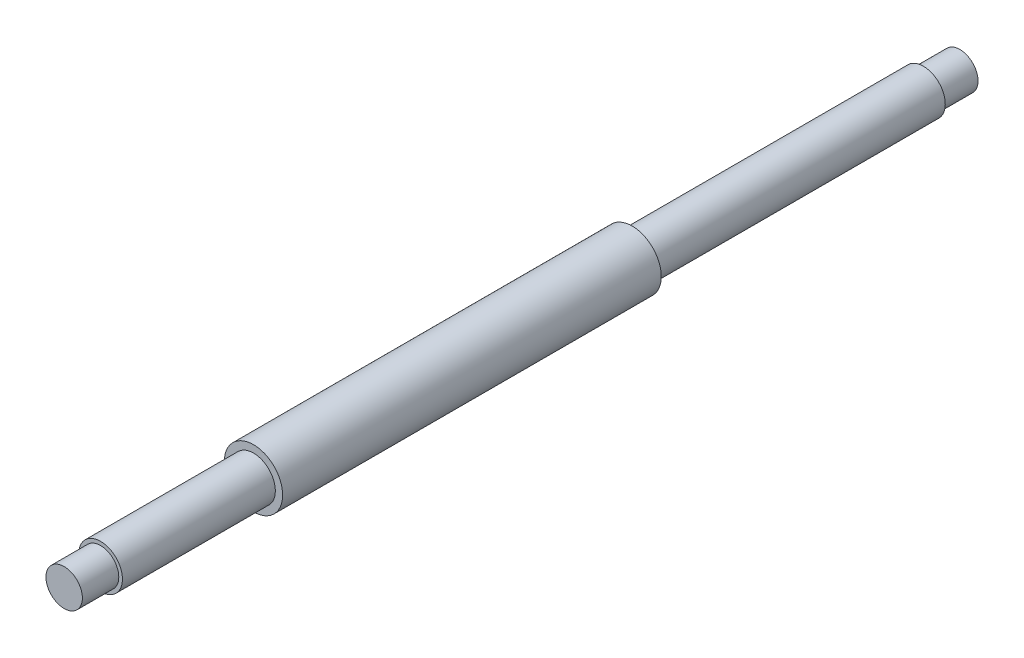
ISO-10303-21;
HEADER;
FILE_DESCRIPTION(('STEP AP214'),'2;1');
FILE_NAME('part.step','',(''),(''),'','','');
FILE_SCHEMA(('AUTOMOTIVE_DESIGN { 1 0 10303 214 1 1 1 1 }'));
ENDSEC;
DATA;
#1=APPLICATION_CONTEXT('core data for automotive mechanical design processes');
#2=APPLICATION_PROTOCOL_DEFINITION('international standard','automotive_design',2000,#1);
#3=PRODUCT_CONTEXT('',#1,'mechanical');
#4=PRODUCT('Part','Part','',(#3));
#5=PRODUCT_RELATED_PRODUCT_CATEGORY('part','',(#4));
#6=PRODUCT_DEFINITION_FORMATION('','',#4);
#7=PRODUCT_DEFINITION_CONTEXT('part definition',#1,'design');
#8=PRODUCT_DEFINITION('design','',#6,#7);
#9=PRODUCT_DEFINITION_SHAPE('','',#8);
#10=(LENGTH_UNIT() NAMED_UNIT(*) SI_UNIT(.MILLI.,.METRE.));
#11=(NAMED_UNIT(*) PLANE_ANGLE_UNIT() SI_UNIT($,.RADIAN.));
#12=(NAMED_UNIT(*) SI_UNIT($,.STERADIAN.) SOLID_ANGLE_UNIT());
#13=UNCERTAINTY_MEASURE_WITH_UNIT(LENGTH_MEASURE(1.E-05),#10,'distance_accuracy_value','');
#14=(GEOMETRIC_REPRESENTATION_CONTEXT(3) GLOBAL_UNCERTAINTY_ASSIGNED_CONTEXT((#13)) GLOBAL_UNIT_ASSIGNED_CONTEXT((#10,
#11,#12)) REPRESENTATION_CONTEXT('',''));
#15=CARTESIAN_POINT('',(0.,0.,0.));
#16=DIRECTION('',(0.,0.,1.));
#17=DIRECTION('',(1.,0.,0.));
#18=AXIS2_PLACEMENT_3D('',#15,#16,#17);
#19=CARTESIAN_POINT('',(0.,0.,52.));
#20=DIRECTION('',(0.,0.,-1.));
#21=DIRECTION('',(-1.,0.,0.));
#22=AXIS2_PLACEMENT_3D('',#19,#20,#21);
#23=CYLINDRICAL_SURFACE('',#22,4.);
#24=CARTESIAN_POINT('',(0.,0.,52.));
#25=DIRECTION('',(0.,0.,1.));
#26=DIRECTION('',(1.,0.,0.));
#27=AXIS2_PLACEMENT_3D('',#24,#25,#26);
#28=CIRCLE('',#27,4.);
#29=CARTESIAN_POINT('',(-4.,0.,52.));
#30=VERTEX_POINT('',#29);
#31=EDGE_CURVE('E65',#30,#30,#28,.T.);
#32=CARTESIAN_POINT('',(0.,0.,0.));
#33=DIRECTION('',(0.,0.,1.));
#34=DIRECTION('',(1.,0.,0.));
#35=AXIS2_PLACEMENT_3D('',#32,#33,#34);
#36=CIRCLE('',#35,4.);
#37=CARTESIAN_POINT('',(-4.,0.,0.));
#38=VERTEX_POINT('',#37);
#39=EDGE_CURVE('E67',#38,#38,#36,.T.);
#40=CARTESIAN_POINT('',(-4.,0.,52.));
#41=CARTESIAN_POINT('',(-4.,0.,51.4583333333333));
#42=CARTESIAN_POINT('',(-4.,0.,50.9166666666667));
#43=CARTESIAN_POINT('',(-4.,0.,49.8333333333333));
#44=CARTESIAN_POINT('',(-4.,0.,49.2916666666667));
#45=CARTESIAN_POINT('',(-4.,0.,48.2083333333333));
#46=CARTESIAN_POINT('',(-4.,0.,47.6666666666667));
#47=CARTESIAN_POINT('',(-4.,0.,46.5833333333333));
#48=CARTESIAN_POINT('',(-4.,0.,46.0416666666667));
#49=CARTESIAN_POINT('',(-4.,0.,44.9583333333333));
#50=CARTESIAN_POINT('',(-4.,0.,44.4166666666667));
#51=CARTESIAN_POINT('',(-4.,0.,43.3333333333333));
#52=CARTESIAN_POINT('',(-4.,0.,42.7916666666667));
#53=CARTESIAN_POINT('',(-4.,0.,41.7083333333333));
#54=CARTESIAN_POINT('',(-4.,0.,41.1666666666667));
#55=CARTESIAN_POINT('',(-4.,0.,40.0833333333333));
#56=CARTESIAN_POINT('',(-4.,0.,39.5416666666667));
#57=CARTESIAN_POINT('',(-4.,0.,38.4583333333333));
#58=CARTESIAN_POINT('',(-4.,0.,37.9166666666667));
#59=CARTESIAN_POINT('',(-4.,0.,36.8333333333333));
#60=CARTESIAN_POINT('',(-4.,0.,36.2916666666667));
#61=CARTESIAN_POINT('',(-4.,0.,35.2083333333333));
#62=CARTESIAN_POINT('',(-4.,0.,34.6666666666667));
#63=CARTESIAN_POINT('',(-4.,0.,33.5833333333333));
#64=CARTESIAN_POINT('',(-4.,0.,33.0416666666667));
#65=CARTESIAN_POINT('',(-4.,0.,31.9583333333333));
#66=CARTESIAN_POINT('',(-4.,0.,31.4166666666667));
#67=CARTESIAN_POINT('',(-4.,0.,30.3333333333333));
#68=CARTESIAN_POINT('',(-4.,0.,29.7916666666667));
#69=CARTESIAN_POINT('',(-4.,0.,28.7083333333333));
#70=CARTESIAN_POINT('',(-4.,0.,28.1666666666667));
#71=CARTESIAN_POINT('',(-4.,0.,27.0833333333333));
#72=CARTESIAN_POINT('',(-4.,0.,26.5416666666667));
#73=CARTESIAN_POINT('',(-4.,0.,25.4583333333333));
#74=CARTESIAN_POINT('',(-4.,0.,24.9166666666667));
#75=CARTESIAN_POINT('',(-4.,0.,23.8333333333333));
#76=CARTESIAN_POINT('',(-4.,0.,23.2916666666667));
#77=CARTESIAN_POINT('',(-4.,0.,22.2083333333333));
#78=CARTESIAN_POINT('',(-4.,0.,21.6666666666667));
#79=CARTESIAN_POINT('',(-4.,0.,20.5833333333333));
#80=CARTESIAN_POINT('',(-4.,0.,20.0416666666667));
#81=CARTESIAN_POINT('',(-4.,0.,18.9583333333333));
#82=CARTESIAN_POINT('',(-4.,0.,18.4166666666667));
#83=CARTESIAN_POINT('',(-4.,0.,17.3333333333333));
#84=CARTESIAN_POINT('',(-4.,0.,16.7916666666667));
#85=CARTESIAN_POINT('',(-4.,0.,15.7083333333333));
#86=CARTESIAN_POINT('',(-4.,0.,15.1666666666667));
#87=CARTESIAN_POINT('',(-4.,0.,14.0833333333333));
#88=CARTESIAN_POINT('',(-4.,0.,13.5416666666667));
#89=CARTESIAN_POINT('',(-4.,0.,12.4583333333333));
#90=CARTESIAN_POINT('',(-4.,0.,11.9166666666667));
#91=CARTESIAN_POINT('',(-4.,0.,10.8333333333333));
#92=CARTESIAN_POINT('',(-4.,0.,10.2916666666667));
#93=CARTESIAN_POINT('',(-4.,0.,9.20833333333333));
#94=CARTESIAN_POINT('',(-4.,0.,8.66666666666667));
#95=CARTESIAN_POINT('',(-4.,0.,7.58333333333333));
#96=CARTESIAN_POINT('',(-4.,0.,7.04166666666667));
#97=CARTESIAN_POINT('',(-4.,0.,5.95833333333333));
#98=CARTESIAN_POINT('',(-4.,0.,5.41666666666667));
#99=CARTESIAN_POINT('',(-4.,0.,4.33333333333333));
#100=CARTESIAN_POINT('',(-4.,0.,3.79166666666667));
#101=CARTESIAN_POINT('',(-4.,0.,2.70833333333334));
#102=CARTESIAN_POINT('',(-4.,0.,2.16666666666667));
#103=CARTESIAN_POINT('',(-4.,0.,1.08333333333333));
#104=CARTESIAN_POINT('',(-4.,0.,0.541666666666667));
#105=CARTESIAN_POINT('',(-4.,0.,0.));
#106=B_SPLINE_CURVE_WITH_KNOTS('',3,(#40,#41,#42,#43,#44,#45,#46,#47,#48,#49,#50,#51,#52,#53,
#54,#55,#56,#57,#58,#59,#60,#61,#62,#63,#64,#65,#66,#67,#68,#69,#70,#71,#72,#73,#74,#75,#76,#77,
#78,#79,#80,#81,#82,#83,#84,#85,#86,#87,#88,#89,#90,#91,#92,#93,#94,#95,#96,#97,#98,#99,#100,
#101,#102,#103,#104,#105),.UNSPECIFIED.,.F.,.F.,(4,2,2,2,2,2,2,2,2,2,2,2,2,2,2,2,2,2,2,2,2,2,2,
2,2,2,2,2,2,2,2,2,4),(0.,1.625,3.25,4.875,6.50000000000001,8.125,9.75,11.375,13.,14.625,16.25,
17.875,19.5,21.125,22.75,24.375,26.,27.625,29.25,30.875,32.5,34.125,35.75,37.375,39.,40.625,
42.25,43.875,45.5,47.125,48.75,50.375,52.),.UNSPECIFIED.);
#107=EDGE_CURVE('BSEAM37',#30,#38,#106,.T.);
#108=ORIENTED_EDGE('',*,*,#31,.F.);
#109=ORIENTED_EDGE('',*,*,#39,.T.);
#110=ORIENTED_EDGE('',*,*,#107,.T.);
#111=ORIENTED_EDGE('',*,*,#107,.F.);
#112=EDGE_LOOP('',(#108,#110,#109,#111));
#113=FACE_BOUND('',#112,.T.);
#114=ADVANCED_FACE('F37',(#113),#23,.T.);
#115=CARTESIAN_POINT('',(0.,0.,52.));
#116=DIRECTION('',(0.,0.,1.));
#117=DIRECTION('',(1.,0.,0.));
#118=AXIS2_PLACEMENT_3D('',#115,#116,#117);
#119=PLANE('',#118);
#120=CARTESIAN_POINT('',(0.,0.,52.));
#121=DIRECTION('',(0.,0.,1.));
#122=DIRECTION('',(1.,0.,0.));
#123=AXIS2_PLACEMENT_3D('',#120,#121,#122);
#124=CIRCLE('',#123,3.);
#125=CARTESIAN_POINT('',(3.,0.,52.));
#126=VERTEX_POINT('',#125);
#127=EDGE_CURVE('E49',#126,#126,#124,.T.);
#128=ORIENTED_EDGE('',*,*,#127,.F.);
#129=EDGE_LOOP('',(#128));
#130=FACE_BOUND('',#129,.T.);
#131=ORIENTED_EDGE('',*,*,#31,.T.);
#132=EDGE_LOOP('',(#131));
#133=FACE_BOUND('',#132,.T.);
#134=ADVANCED_FACE('F93',(#130,#133),#119,.T.);
#135=CARTESIAN_POINT('',(0.,0.,0.));
#136=DIRECTION('',(0.,0.,1.));
#137=DIRECTION('',(1.,0.,0.));
#138=AXIS2_PLACEMENT_3D('',#135,#136,#137);
#139=PLANE('',#138);
#140=CARTESIAN_POINT('',(0.,0.,0.));
#141=DIRECTION('',(0.,0.,1.));
#142=DIRECTION('',(1.,0.,0.));
#143=AXIS2_PLACEMENT_3D('',#140,#141,#142);
#144=CIRCLE('',#143,3.);
#145=CARTESIAN_POINT('',(3.,0.,0.));
#146=VERTEX_POINT('',#145);
#147=EDGE_CURVE('E40',#146,#146,#144,.T.);
#148=ORIENTED_EDGE('',*,*,#147,.T.);
#149=EDGE_LOOP('',(#148));
#150=FACE_BOUND('',#149,.T.);
#151=ORIENTED_EDGE('',*,*,#39,.F.);
#152=EDGE_LOOP('',(#151));
#153=FACE_BOUND('',#152,.T.);
#154=ADVANCED_FACE('F74',(#150,#153),#139,.F.);
#155=CARTESIAN_POINT('',(0.,0.,-40.));
#156=DIRECTION('',(0.,0.,1.));
#157=DIRECTION('',(1.,0.,0.));
#158=AXIS2_PLACEMENT_3D('',#155,#156,#157);
#159=PLANE('',#158);
#160=CARTESIAN_POINT('',(0.,0.,-40.));
#161=DIRECTION('',(0.,0.,-1.));
#162=DIRECTION('',(-1.,0.,0.));
#163=AXIS2_PLACEMENT_3D('',#160,#161,#162);
#164=CIRCLE('',#163,2.5);
#165=CARTESIAN_POINT('',(-2.5,0.,-40.));
#166=VERTEX_POINT('',#165);
#167=EDGE_CURVE('E44',#166,#166,#164,.T.);
#168=ORIENTED_EDGE('',*,*,#167,.F.);
#169=EDGE_LOOP('',(#168));
#170=FACE_BOUND('',#169,.T.);
#171=CARTESIAN_POINT('',(0.,0.,-40.));
#172=DIRECTION('',(0.,0.,1.));
#173=DIRECTION('',(1.,0.,0.));
#174=AXIS2_PLACEMENT_3D('',#171,#172,#173);
#175=CIRCLE('',#174,3.);
#176=CARTESIAN_POINT('',(3.,0.,-40.));
#177=VERTEX_POINT('',#176);
#178=EDGE_CURVE('E60',#177,#177,#175,.T.);
#179=ORIENTED_EDGE('',*,*,#178,.F.);
#180=EDGE_LOOP('',(#179));
#181=FACE_BOUND('',#180,.T.);
#182=ADVANCED_FACE('F80',(#170,#181),#159,.F.);
#183=CARTESIAN_POINT('',(0.,0.,-40.));
#184=DIRECTION('',(0.,0.,1.));
#185=DIRECTION('',(1.,0.,0.));
#186=AXIS2_PLACEMENT_3D('',#183,#184,#185);
#187=CYLINDRICAL_SURFACE('',#186,3.);
#188=ORIENTED_EDGE('',*,*,#178,.T.);
#189=EDGE_LOOP('',(#188));
#190=FACE_BOUND('',#189,.T.);
#191=ORIENTED_EDGE('',*,*,#147,.F.);
#192=EDGE_LOOP('',(#191));
#193=FACE_BOUND('',#192,.T.);
#194=ADVANCED_FACE('F77',(#190,#193),#187,.T.);
#195=ORIENTED_EDGE('',*,*,#127,.T.);
#196=EDGE_LOOP('',(#195));
#197=FACE_BOUND('',#196,.T.);
#198=CARTESIAN_POINT('',(0.,0.,73.));
#199=DIRECTION('',(0.,0.,1.));
#200=DIRECTION('',(1.,0.,0.));
#201=AXIS2_PLACEMENT_3D('',#198,#199,#200);
#202=CIRCLE('',#201,3.);
#203=CARTESIAN_POINT('',(3.,0.,73.));
#204=VERTEX_POINT('',#203);
#205=EDGE_CURVE('E56',#204,#204,#202,.T.);
#206=ORIENTED_EDGE('',*,*,#205,.F.);
#207=EDGE_LOOP('',(#206));
#208=FACE_BOUND('',#207,.T.);
#209=ADVANCED_FACE('F79',(#197,#208),#187,.T.);
#210=CARTESIAN_POINT('',(0.,0.,73.));
#211=DIRECTION('',(0.,0.,1.));
#212=DIRECTION('',(1.,0.,0.));
#213=AXIS2_PLACEMENT_3D('',#210,#211,#212);
#214=PLANE('',#213);
#215=CARTESIAN_POINT('',(0.,0.,73.));
#216=DIRECTION('',(0.,0.,1.));
#217=DIRECTION('',(1.,0.,0.));
#218=AXIS2_PLACEMENT_3D('',#215,#216,#217);
#219=CIRCLE('',#218,2.5);
#220=CARTESIAN_POINT('',(2.5,0.,73.));
#221=VERTEX_POINT('',#220);
#222=EDGE_CURVE('E10',#221,#221,#219,.T.);
#223=ORIENTED_EDGE('',*,*,#222,.F.);
#224=EDGE_LOOP('',(#223));
#225=FACE_BOUND('',#224,.T.);
#226=ORIENTED_EDGE('',*,*,#205,.T.);
#227=EDGE_LOOP('',(#226));
#228=FACE_BOUND('',#227,.T.);
#229=ADVANCED_FACE('F87',(#225,#228),#214,.T.);
#230=CARTESIAN_POINT('',(0.,0.,-45.));
#231=DIRECTION('',(0.,0.,1.));
#232=DIRECTION('',(1.,0.,0.));
#233=AXIS2_PLACEMENT_3D('',#230,#231,#232);
#234=CYLINDRICAL_SURFACE('',#233,2.5);
#235=CARTESIAN_POINT('',(0.,0.,-45.));
#236=DIRECTION('',(0.,0.,-1.));
#237=DIRECTION('',(-1.,0.,0.));
#238=AXIS2_PLACEMENT_3D('',#235,#236,#237);
#239=CIRCLE('',#238,2.5);
#240=CARTESIAN_POINT('',(-2.5,0.,-45.));
#241=VERTEX_POINT('',#240);
#242=EDGE_CURVE('E54',#241,#241,#239,.T.);
#243=ORIENTED_EDGE('',*,*,#242,.F.);
#244=EDGE_LOOP('',(#243));
#245=FACE_BOUND('',#244,.T.);
#246=ORIENTED_EDGE('',*,*,#167,.T.);
#247=EDGE_LOOP('',(#246));
#248=FACE_BOUND('',#247,.T.);
#249=ADVANCED_FACE('F109',(#245,#248),#234,.T.);
#250=CARTESIAN_POINT('',(0.,0.,-45.));
#251=DIRECTION('',(0.,0.,-1.));
#252=DIRECTION('',(-1.,0.,0.));
#253=AXIS2_PLACEMENT_3D('',#250,#251,#252);
#254=PLANE('',#253);
#255=ORIENTED_EDGE('',*,*,#242,.T.);
#256=EDGE_LOOP('',(#255));
#257=FACE_BOUND('',#256,.T.);
#258=ADVANCED_FACE('F115',(#257),#254,.T.);
#259=CARTESIAN_POINT('',(0.,0.,78.));
#260=DIRECTION('',(0.,0.,-1.));
#261=DIRECTION('',(-1.,0.,0.));
#262=AXIS2_PLACEMENT_3D('',#259,#260,#261);
#263=CYLINDRICAL_SURFACE('',#262,2.5);
#264=CARTESIAN_POINT('',(0.,0.,78.));
#265=DIRECTION('',(0.,0.,1.));
#266=DIRECTION('',(1.,0.,0.));
#267=AXIS2_PLACEMENT_3D('',#264,#265,#266);
#268=CIRCLE('',#267,2.5);
#269=CARTESIAN_POINT('',(2.5,0.,78.));
#270=VERTEX_POINT('',#269);
#271=EDGE_CURVE('E53',#270,#270,#268,.T.);
#272=ORIENTED_EDGE('',*,*,#271,.F.);
#273=EDGE_LOOP('',(#272));
#274=FACE_BOUND('',#273,.T.);
#275=ORIENTED_EDGE('',*,*,#222,.T.);
#276=EDGE_LOOP('',(#275));
#277=FACE_BOUND('',#276,.T.);
#278=ADVANCED_FACE('F121',(#274,#277),#263,.T.);
#279=CARTESIAN_POINT('',(0.,0.,78.));
#280=DIRECTION('',(0.,0.,1.));
#281=DIRECTION('',(1.,0.,0.));
#282=AXIS2_PLACEMENT_3D('',#279,#280,#281);
#283=PLANE('',#282);
#284=ORIENTED_EDGE('',*,*,#271,.T.);
#285=EDGE_LOOP('',(#284));
#286=FACE_BOUND('',#285,.T.);
#287=ADVANCED_FACE('F125',(#286),#283,.T.);
#288=CLOSED_SHELL('',(#114,#134,#154,#182,#194,#209,#229,#249,#258,#278,#287));
#289=MANIFOLD_SOLID_BREP('B2',#288);
#290=ADVANCED_BREP_SHAPE_REPRESENTATION('',(#18,#289),#14);
#291=SHAPE_DEFINITION_REPRESENTATION(#9,#290);
ENDSEC;
END-ISO-10303-21;
